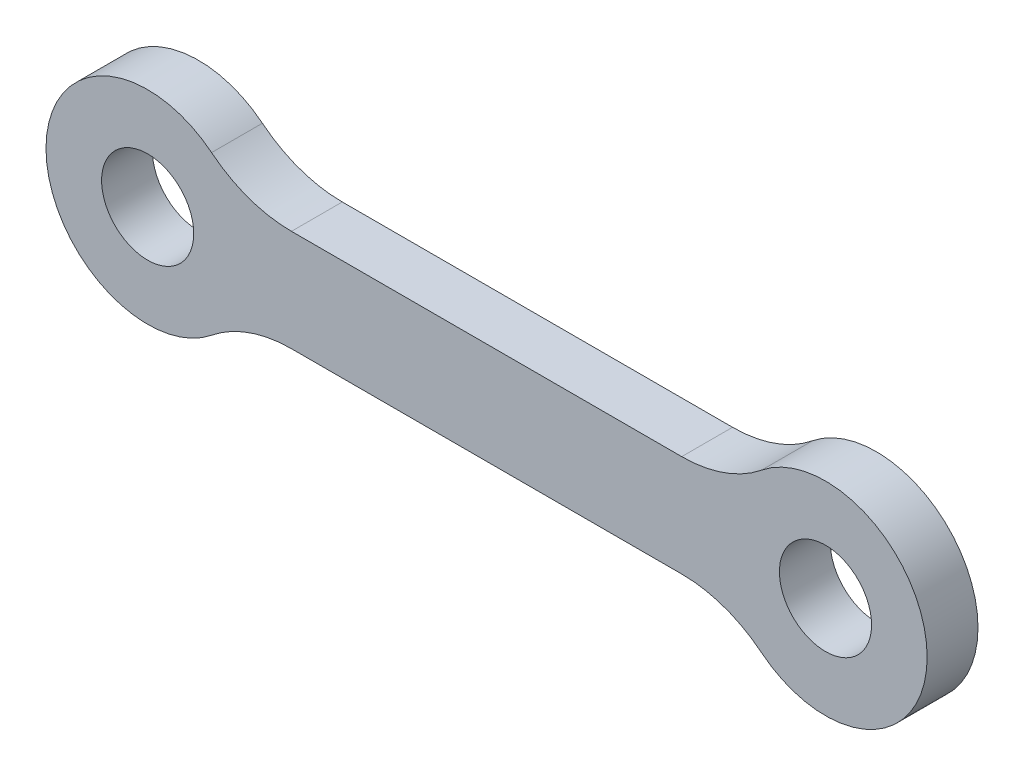
ISO-10303-21;
HEADER;
FILE_DESCRIPTION(('STEP AP214'),'2;1');
FILE_NAME('part.step','',(''),(''),'','','');
FILE_SCHEMA(('AUTOMOTIVE_DESIGN { 1 0 10303 214 1 1 1 1 }'));
ENDSEC;
DATA;
#1=APPLICATION_CONTEXT('core data for automotive mechanical design processes');
#2=APPLICATION_PROTOCOL_DEFINITION('international standard','automotive_design',2000,#1);
#3=PRODUCT_CONTEXT('',#1,'mechanical');
#4=PRODUCT('Part','Part','',(#3));
#5=PRODUCT_RELATED_PRODUCT_CATEGORY('part','',(#4));
#6=PRODUCT_DEFINITION_FORMATION('','',#4);
#7=PRODUCT_DEFINITION_CONTEXT('part definition',#1,'design');
#8=PRODUCT_DEFINITION('design','',#6,#7);
#9=PRODUCT_DEFINITION_SHAPE('','',#8);
#10=(LENGTH_UNIT() NAMED_UNIT(*) SI_UNIT(.MILLI.,.METRE.));
#11=(NAMED_UNIT(*) PLANE_ANGLE_UNIT() SI_UNIT($,.RADIAN.));
#12=(NAMED_UNIT(*) SI_UNIT($,.STERADIAN.) SOLID_ANGLE_UNIT());
#13=UNCERTAINTY_MEASURE_WITH_UNIT(LENGTH_MEASURE(1.E-05),#10,'distance_accuracy_value','');
#14=(GEOMETRIC_REPRESENTATION_CONTEXT(3) GLOBAL_UNCERTAINTY_ASSIGNED_CONTEXT((#13)) GLOBAL_UNIT_ASSIGNED_CONTEXT((#10,
#11,#12)) REPRESENTATION_CONTEXT('',''));
#15=CARTESIAN_POINT('',(0.,0.,0.));
#16=DIRECTION('',(0.,0.,1.));
#17=DIRECTION('',(1.,0.,0.));
#18=AXIS2_PLACEMENT_3D('',#15,#16,#17);
#19=CARTESIAN_POINT('',(53.3649235396227,17.78,5.08));
#20=DIRECTION('',(0.,0.,-1.));
#21=DIRECTION('',(-1.,0.,0.));
#22=AXIS2_PLACEMENT_3D('',#19,#20,#21);
#23=PLANE('',#22);
#24=CARTESIAN_POINT('',(53.3649235396227,17.78,5.08));
#25=DIRECTION('',(0.,0.,-1.));
#26=DIRECTION('',(-1.,0.,0.));
#27=AXIS2_PLACEMENT_3D('',#24,#25,#26);
#28=CIRCLE('',#27,12.7);
#29=CARTESIAN_POINT('',(61.3473734250175,7.90222222222223,5.08));
#30=VERTEX_POINT('',#29);
#31=CARTESIAN_POINT('',(53.3649235396227,5.08,5.08));
#32=VERTEX_POINT('',#31);
#33=EDGE_CURVE('E150',#30,#32,#28,.T.);
#34=ORIENTED_EDGE('',*,*,#33,.T.);
#35=DIRECTION('',(-1.,0.,0.));
#36=VECTOR('',#35,1.);
#37=CARTESIAN_POINT('',(14.3684097937107,5.08,5.08));
#38=LINE('',#37,#36);
#39=CARTESIAN_POINT('',(14.3684097937107,5.08,5.08));
#40=VERTEX_POINT('',#39);
#41=EDGE_CURVE('E98',#32,#40,#38,.T.);
#42=ORIENTED_EDGE('',*,*,#41,.T.);
#43=CARTESIAN_POINT('',(14.3684097937107,17.78,5.08));
#44=DIRECTION('',(0.,0.,-1.));
#45=DIRECTION('',(-1.,0.,0.));
#46=AXIS2_PLACEMENT_3D('',#43,#44,#45);
#47=CIRCLE('',#46,12.7);
#48=CARTESIAN_POINT('',(6.38595990831585,7.90222222222222,5.08));
#49=VERTEX_POINT('',#48);
#50=EDGE_CURVE('E165',#40,#49,#47,.T.);
#51=ORIENTED_EDGE('',*,*,#50,.T.);
#52=CARTESIAN_POINT('',(0.,0.,5.08));
#53=DIRECTION('',(0.,0.,1.));
#54=DIRECTION('',(1.,0.,0.));
#55=AXIS2_PLACEMENT_3D('',#52,#53,#54);
#56=CIRCLE('',#55,10.16);
#57=CARTESIAN_POINT('',(6.38595990831585,-7.90222222222222,5.08));
#58=VERTEX_POINT('',#57);
#59=EDGE_CURVE('E178',#49,#58,#56,.T.);
#60=ORIENTED_EDGE('',*,*,#59,.T.);
#61=CARTESIAN_POINT('',(14.3684097937107,-17.78,5.08));
#62=DIRECTION('',(0.,0.,-1.));
#63=DIRECTION('',(1.,0.,0.));
#64=AXIS2_PLACEMENT_3D('',#61,#62,#63);
#65=CIRCLE('',#64,12.7);
#66=CARTESIAN_POINT('',(14.3684097937107,-5.08,5.08));
#67=VERTEX_POINT('',#66);
#68=EDGE_CURVE('E117',#58,#67,#65,.T.);
#69=ORIENTED_EDGE('',*,*,#68,.T.);
#70=DIRECTION('',(1.,0.,0.));
#71=VECTOR('',#70,1.);
#72=CARTESIAN_POINT('',(14.3684097937107,-5.08,5.08));
#73=LINE('',#72,#71);
#74=CARTESIAN_POINT('',(53.3649235396227,-5.08,5.08));
#75=VERTEX_POINT('',#74);
#76=EDGE_CURVE('E111',#67,#75,#73,.T.);
#77=ORIENTED_EDGE('',*,*,#76,.T.);
#78=CARTESIAN_POINT('',(53.3649235396227,-17.78,5.08));
#79=DIRECTION('',(0.,0.,-1.));
#80=DIRECTION('',(-1.,0.,0.));
#81=AXIS2_PLACEMENT_3D('',#78,#79,#80);
#82=CIRCLE('',#81,12.7);
#83=CARTESIAN_POINT('',(61.3473734250175,-7.90222222222222,5.08));
#84=VERTEX_POINT('',#83);
#85=EDGE_CURVE('E115',#75,#84,#82,.T.);
#86=ORIENTED_EDGE('',*,*,#85,.T.);
#87=CARTESIAN_POINT('',(67.7333333333333,0.,5.08));
#88=DIRECTION('',(0.,0.,1.));
#89=DIRECTION('',(1.,0.,0.));
#90=AXIS2_PLACEMENT_3D('',#87,#88,#89);
#91=CIRCLE('',#90,10.16);
#92=EDGE_CURVE('E55',#84,#30,#91,.T.);
#93=ORIENTED_EDGE('',*,*,#92,.T.);
#94=EDGE_LOOP('',(#34,#42,#51,#60,#69,#77,#86,#93));
#95=FACE_BOUND('',#94,.T.);
#96=CARTESIAN_POINT('',(0.,0.,5.08));
#97=DIRECTION('',(0.,0.,1.));
#98=DIRECTION('',(1.,0.,0.));
#99=AXIS2_PLACEMENT_3D('',#96,#97,#98);
#100=CIRCLE('',#99,4.60375);
#101=CARTESIAN_POINT('',(4.60375,0.,5.08));
#102=VERTEX_POINT('',#101);
#103=EDGE_CURVE('E139',#102,#102,#100,.T.);
#104=ORIENTED_EDGE('',*,*,#103,.F.);
#105=EDGE_LOOP('',(#104));
#106=FACE_BOUND('',#105,.T.);
#107=CARTESIAN_POINT('',(67.7333333333333,0.,5.08));
#108=DIRECTION('',(0.,0.,1.));
#109=DIRECTION('',(1.,0.,0.));
#110=AXIS2_PLACEMENT_3D('',#107,#108,#109);
#111=CIRCLE('',#110,4.60375000000001);
#112=CARTESIAN_POINT('',(72.3370833333333,0.,5.08));
#113=VERTEX_POINT('',#112);
#114=EDGE_CURVE('E187',#113,#113,#111,.T.);
#115=ORIENTED_EDGE('',*,*,#114,.F.);
#116=EDGE_LOOP('',(#115));
#117=FACE_BOUND('',#116,.T.);
#118=ADVANCED_FACE('F38',(#95,#106,#117),#23,.F.);
#119=CARTESIAN_POINT('',(53.3649235396227,17.78,0.));
#120=DIRECTION('',(0.,0.,-1.));
#121=DIRECTION('',(-1.,0.,0.));
#122=AXIS2_PLACEMENT_3D('',#119,#120,#121);
#123=PLANE('',#122);
#124=CARTESIAN_POINT('',(0.,0.,0.));
#125=DIRECTION('',(0.,0.,1.));
#126=DIRECTION('',(1.,0.,0.));
#127=AXIS2_PLACEMENT_3D('',#124,#125,#126);
#128=CIRCLE('',#127,4.60375);
#129=CARTESIAN_POINT('',(4.60375,0.,0.));
#130=VERTEX_POINT('',#129);
#131=EDGE_CURVE('E184',#130,#130,#128,.T.);
#132=ORIENTED_EDGE('',*,*,#131,.T.);
#133=EDGE_LOOP('',(#132));
#134=FACE_BOUND('',#133,.T.);
#135=CARTESIAN_POINT('',(53.3649235396227,17.78,0.));
#136=DIRECTION('',(0.,0.,-1.));
#137=DIRECTION('',(-1.,0.,0.));
#138=AXIS2_PLACEMENT_3D('',#135,#136,#137);
#139=CIRCLE('',#138,12.7);
#140=CARTESIAN_POINT('',(61.3473734250175,7.90222222222223,0.));
#141=VERTEX_POINT('',#140);
#142=CARTESIAN_POINT('',(53.3649235396227,5.08,0.));
#143=VERTEX_POINT('',#142);
#144=EDGE_CURVE('E135',#141,#143,#139,.T.);
#145=ORIENTED_EDGE('',*,*,#144,.F.);
#146=CARTESIAN_POINT('',(67.7333333333333,0.,0.));
#147=DIRECTION('',(0.,0.,1.));
#148=DIRECTION('',(1.,0.,0.));
#149=AXIS2_PLACEMENT_3D('',#146,#147,#148);
#150=CIRCLE('',#149,10.16);
#151=CARTESIAN_POINT('',(61.3473734250175,-7.90222222222222,0.));
#152=VERTEX_POINT('',#151);
#153=EDGE_CURVE('E90',#152,#141,#150,.T.);
#154=ORIENTED_EDGE('',*,*,#153,.F.);
#155=CARTESIAN_POINT('',(53.3649235396227,-17.78,0.));
#156=DIRECTION('',(0.,0.,-1.));
#157=DIRECTION('',(-1.,0.,0.));
#158=AXIS2_PLACEMENT_3D('',#155,#156,#157);
#159=CIRCLE('',#158,12.7);
#160=CARTESIAN_POINT('',(53.3649235396227,-5.08,0.));
#161=VERTEX_POINT('',#160);
#162=EDGE_CURVE('E84',#161,#152,#159,.T.);
#163=ORIENTED_EDGE('',*,*,#162,.F.);
#164=DIRECTION('',(1.,0.,0.));
#165=VECTOR('',#164,1.);
#166=CARTESIAN_POINT('',(14.3684097937107,-5.08,0.));
#167=LINE('',#166,#165);
#168=CARTESIAN_POINT('',(14.3684097937107,-5.08,0.));
#169=VERTEX_POINT('',#168);
#170=EDGE_CURVE('E125',#169,#161,#167,.T.);
#171=ORIENTED_EDGE('',*,*,#170,.F.);
#172=CARTESIAN_POINT('',(14.3684097937107,-17.78,0.));
#173=DIRECTION('',(0.,0.,-1.));
#174=DIRECTION('',(1.,0.,0.));
#175=AXIS2_PLACEMENT_3D('',#172,#173,#174);
#176=CIRCLE('',#175,12.7);
#177=CARTESIAN_POINT('',(6.38595990831585,-7.90222222222222,0.));
#178=VERTEX_POINT('',#177);
#179=EDGE_CURVE('E145',#178,#169,#176,.T.);
#180=ORIENTED_EDGE('',*,*,#179,.F.);
#181=CARTESIAN_POINT('',(0.,0.,0.));
#182=DIRECTION('',(0.,0.,1.));
#183=DIRECTION('',(1.,0.,0.));
#184=AXIS2_PLACEMENT_3D('',#181,#182,#183);
#185=CIRCLE('',#184,10.16);
#186=CARTESIAN_POINT('',(6.38595990831585,7.90222222222222,0.));
#187=VERTEX_POINT('',#186);
#188=EDGE_CURVE('E143',#187,#178,#185,.T.);
#189=ORIENTED_EDGE('',*,*,#188,.F.);
#190=CARTESIAN_POINT('',(14.3684097937107,17.78,0.));
#191=DIRECTION('',(0.,0.,-1.));
#192=DIRECTION('',(-1.,0.,0.));
#193=AXIS2_PLACEMENT_3D('',#190,#191,#192);
#194=CIRCLE('',#193,12.7);
#195=CARTESIAN_POINT('',(14.3684097937107,5.08,0.));
#196=VERTEX_POINT('',#195);
#197=EDGE_CURVE('E141',#196,#187,#194,.T.);
#198=ORIENTED_EDGE('',*,*,#197,.F.);
#199=DIRECTION('',(-1.,0.,0.));
#200=VECTOR('',#199,1.);
#201=CARTESIAN_POINT('',(14.3684097937107,5.08,0.));
#202=LINE('',#201,#200);
#203=EDGE_CURVE('E138',#143,#196,#202,.T.);
#204=ORIENTED_EDGE('',*,*,#203,.F.);
#205=EDGE_LOOP('',(#145,#154,#163,#171,#180,#189,#198,#204));
#206=FACE_BOUND('',#205,.T.);
#207=CARTESIAN_POINT('',(67.7333333333333,0.,0.));
#208=DIRECTION('',(0.,0.,1.));
#209=DIRECTION('',(1.,0.,0.));
#210=AXIS2_PLACEMENT_3D('',#207,#208,#209);
#211=CIRCLE('',#210,4.60375000000001);
#212=CARTESIAN_POINT('',(72.3370833333333,0.,0.));
#213=VERTEX_POINT('',#212);
#214=EDGE_CURVE('E190',#213,#213,#211,.T.);
#215=ORIENTED_EDGE('',*,*,#214,.T.);
#216=EDGE_LOOP('',(#215));
#217=FACE_BOUND('',#216,.T.);
#218=ADVANCED_FACE('F169',(#134,#206,#217),#123,.T.);
#219=CARTESIAN_POINT('',(53.3649235396227,17.78,5.08));
#220=DIRECTION('',(0.,0.,-1.));
#221=DIRECTION('',(-1.,0.,0.));
#222=AXIS2_PLACEMENT_3D('',#219,#220,#221);
#223=CYLINDRICAL_SURFACE('',#222,12.7);
#224=ORIENTED_EDGE('',*,*,#144,.T.);
#225=DIRECTION('',(0.,0.,-1.));
#226=VECTOR('',#225,1.);
#227=CARTESIAN_POINT('',(53.3649235396227,5.08,5.08));
#228=LINE('',#227,#226);
#229=EDGE_CURVE('E11',#32,#143,#228,.T.);
#230=ORIENTED_EDGE('',*,*,#229,.F.);
#231=ORIENTED_EDGE('',*,*,#33,.F.);
#232=DIRECTION('',(0.,0.,-1.));
#233=VECTOR('',#232,1.);
#234=CARTESIAN_POINT('',(61.3473734250175,7.90222222222223,5.08));
#235=LINE('',#234,#233);
#236=EDGE_CURVE('E131',#30,#141,#235,.T.);
#237=ORIENTED_EDGE('',*,*,#236,.T.);
#238=EDGE_LOOP('',(#224,#230,#231,#237));
#239=FACE_BOUND('',#238,.T.);
#240=ADVANCED_FACE('F40',(#239),#223,.F.);
#241=CARTESIAN_POINT('',(14.3684097937107,5.08,5.08));
#242=DIRECTION('',(0.,-1.,0.));
#243=DIRECTION('',(0.,0.,-1.));
#244=AXIS2_PLACEMENT_3D('',#241,#242,#243);
#245=PLANE('',#244);
#246=ORIENTED_EDGE('',*,*,#203,.T.);
#247=DIRECTION('',(0.,0.,-1.));
#248=VECTOR('',#247,1.);
#249=CARTESIAN_POINT('',(14.3684097937107,5.08,5.08));
#250=LINE('',#249,#248);
#251=EDGE_CURVE('E47',#40,#196,#250,.T.);
#252=ORIENTED_EDGE('',*,*,#251,.F.);
#253=ORIENTED_EDGE('',*,*,#41,.F.);
#254=ORIENTED_EDGE('',*,*,#229,.T.);
#255=EDGE_LOOP('',(#246,#252,#253,#254));
#256=FACE_BOUND('',#255,.T.);
#257=ADVANCED_FACE('F222',(#256),#245,.F.);
#258=CARTESIAN_POINT('',(14.3684097937107,17.78,5.08));
#259=DIRECTION('',(0.,0.,-1.));
#260=DIRECTION('',(-1.,0.,0.));
#261=AXIS2_PLACEMENT_3D('',#258,#259,#260);
#262=CYLINDRICAL_SURFACE('',#261,12.7);
#263=ORIENTED_EDGE('',*,*,#197,.T.);
#264=DIRECTION('',(0.,0.,-1.));
#265=VECTOR('',#264,1.);
#266=CARTESIAN_POINT('',(6.38595990831585,7.90222222222222,5.08));
#267=LINE('',#266,#265);
#268=EDGE_CURVE('E157',#49,#187,#267,.T.);
#269=ORIENTED_EDGE('',*,*,#268,.F.);
#270=ORIENTED_EDGE('',*,*,#50,.F.);
#271=ORIENTED_EDGE('',*,*,#251,.T.);
#272=EDGE_LOOP('',(#263,#269,#270,#271));
#273=FACE_BOUND('',#272,.T.);
#274=ADVANCED_FACE('F163',(#273),#262,.F.);
#275=CARTESIAN_POINT('',(0.,0.,5.08));
#276=DIRECTION('',(0.,0.,-1.));
#277=DIRECTION('',(-1.,0.,0.));
#278=AXIS2_PLACEMENT_3D('',#275,#276,#277);
#279=CYLINDRICAL_SURFACE('',#278,10.16);
#280=ORIENTED_EDGE('',*,*,#188,.T.);
#281=DIRECTION('',(0.,0.,-1.));
#282=VECTOR('',#281,1.);
#283=CARTESIAN_POINT('',(6.38595990831585,-7.90222222222222,5.08));
#284=LINE('',#283,#282);
#285=EDGE_CURVE('E154',#58,#178,#284,.T.);
#286=ORIENTED_EDGE('',*,*,#285,.F.);
#287=ORIENTED_EDGE('',*,*,#59,.F.);
#288=ORIENTED_EDGE('',*,*,#268,.T.);
#289=EDGE_LOOP('',(#280,#286,#287,#288));
#290=FACE_BOUND('',#289,.T.);
#291=ADVANCED_FACE('F174',(#290),#279,.T.);
#292=CARTESIAN_POINT('',(14.3684097937107,-17.78,5.08));
#293=DIRECTION('',(0.,0.,-1.));
#294=DIRECTION('',(-1.,0.,0.));
#295=AXIS2_PLACEMENT_3D('',#292,#293,#294);
#296=CYLINDRICAL_SURFACE('',#295,12.7);
#297=ORIENTED_EDGE('',*,*,#179,.T.);
#298=DIRECTION('',(0.,0.,-1.));
#299=VECTOR('',#298,1.);
#300=CARTESIAN_POINT('',(14.3684097937107,-5.08,5.08));
#301=LINE('',#300,#299);
#302=EDGE_CURVE('E126',#67,#169,#301,.T.);
#303=ORIENTED_EDGE('',*,*,#302,.F.);
#304=ORIENTED_EDGE('',*,*,#68,.F.);
#305=ORIENTED_EDGE('',*,*,#285,.T.);
#306=EDGE_LOOP('',(#297,#303,#304,#305));
#307=FACE_BOUND('',#306,.T.);
#308=ADVANCED_FACE('F177',(#307),#296,.F.);
#309=CARTESIAN_POINT('',(14.3684097937107,-5.08,5.08));
#310=DIRECTION('',(0.,1.,0.));
#311=DIRECTION('',(0.,0.,1.));
#312=AXIS2_PLACEMENT_3D('',#309,#310,#311);
#313=PLANE('',#312);
#314=ORIENTED_EDGE('',*,*,#170,.T.);
#315=DIRECTION('',(0.,0.,-1.));
#316=VECTOR('',#315,1.);
#317=CARTESIAN_POINT('',(53.3649235396227,-5.08,5.08));
#318=LINE('',#317,#316);
#319=EDGE_CURVE('E122',#75,#161,#318,.T.);
#320=ORIENTED_EDGE('',*,*,#319,.F.);
#321=ORIENTED_EDGE('',*,*,#76,.F.);
#322=ORIENTED_EDGE('',*,*,#302,.T.);
#323=EDGE_LOOP('',(#314,#320,#321,#322));
#324=FACE_BOUND('',#323,.T.);
#325=ADVANCED_FACE('F123',(#324),#313,.F.);
#326=CARTESIAN_POINT('',(53.3649235396227,-17.78,5.08));
#327=DIRECTION('',(0.,0.,-1.));
#328=DIRECTION('',(-1.,0.,0.));
#329=AXIS2_PLACEMENT_3D('',#326,#327,#328);
#330=CYLINDRICAL_SURFACE('',#329,12.7);
#331=ORIENTED_EDGE('',*,*,#162,.T.);
#332=DIRECTION('',(0.,0.,-1.));
#333=VECTOR('',#332,1.);
#334=CARTESIAN_POINT('',(61.3473734250175,-7.90222222222222,5.08));
#335=LINE('',#334,#333);
#336=EDGE_CURVE('E127',#84,#152,#335,.T.);
#337=ORIENTED_EDGE('',*,*,#336,.F.);
#338=ORIENTED_EDGE('',*,*,#85,.F.);
#339=ORIENTED_EDGE('',*,*,#319,.T.);
#340=EDGE_LOOP('',(#331,#337,#338,#339));
#341=FACE_BOUND('',#340,.T.);
#342=ADVANCED_FACE('F129',(#341),#330,.F.);
#343=CARTESIAN_POINT('',(67.7333333333333,0.,5.08));
#344=DIRECTION('',(0.,0.,-1.));
#345=DIRECTION('',(-1.,0.,0.));
#346=AXIS2_PLACEMENT_3D('',#343,#344,#345);
#347=CYLINDRICAL_SURFACE('',#346,10.16);
#348=ORIENTED_EDGE('',*,*,#153,.T.);
#349=ORIENTED_EDGE('',*,*,#236,.F.);
#350=ORIENTED_EDGE('',*,*,#92,.F.);
#351=ORIENTED_EDGE('',*,*,#336,.T.);
#352=EDGE_LOOP('',(#348,#349,#350,#351));
#353=FACE_BOUND('',#352,.T.);
#354=ADVANCED_FACE('F210',(#353),#347,.T.);
#355=CARTESIAN_POINT('',(0.,0.,5.08));
#356=DIRECTION('',(0.,0.,-1.));
#357=DIRECTION('',(-1.,0.,0.));
#358=AXIS2_PLACEMENT_3D('',#355,#356,#357);
#359=CYLINDRICAL_SURFACE('',#358,4.60375);
#360=ORIENTED_EDGE('',*,*,#103,.T.);
#361=EDGE_LOOP('',(#360));
#362=FACE_BOUND('',#361,.T.);
#363=ORIENTED_EDGE('',*,*,#131,.F.);
#364=EDGE_LOOP('',(#363));
#365=FACE_BOUND('',#364,.T.);
#366=ADVANCED_FACE('F207',(#362,#365),#359,.F.);
#367=CARTESIAN_POINT('',(67.7333333333333,0.,5.08));
#368=DIRECTION('',(0.,0.,-1.));
#369=DIRECTION('',(-1.,0.,0.));
#370=AXIS2_PLACEMENT_3D('',#367,#368,#369);
#371=CYLINDRICAL_SURFACE('',#370,4.60375000000001);
#372=ORIENTED_EDGE('',*,*,#114,.T.);
#373=EDGE_LOOP('',(#372));
#374=FACE_BOUND('',#373,.T.);
#375=ORIENTED_EDGE('',*,*,#214,.F.);
#376=EDGE_LOOP('',(#375));
#377=FACE_BOUND('',#376,.T.);
#378=ADVANCED_FACE('F196',(#374,#377),#371,.F.);
#379=CLOSED_SHELL('',(#118,#218,#240,#257,#274,#291,#308,#325,#342,#354,#366,#378));
#380=MANIFOLD_SOLID_BREP('B2',#379);
#381=ADVANCED_BREP_SHAPE_REPRESENTATION('',(#18,#380),#14);
#382=SHAPE_DEFINITION_REPRESENTATION(#9,#381);
ENDSEC;
END-ISO-10303-21;
